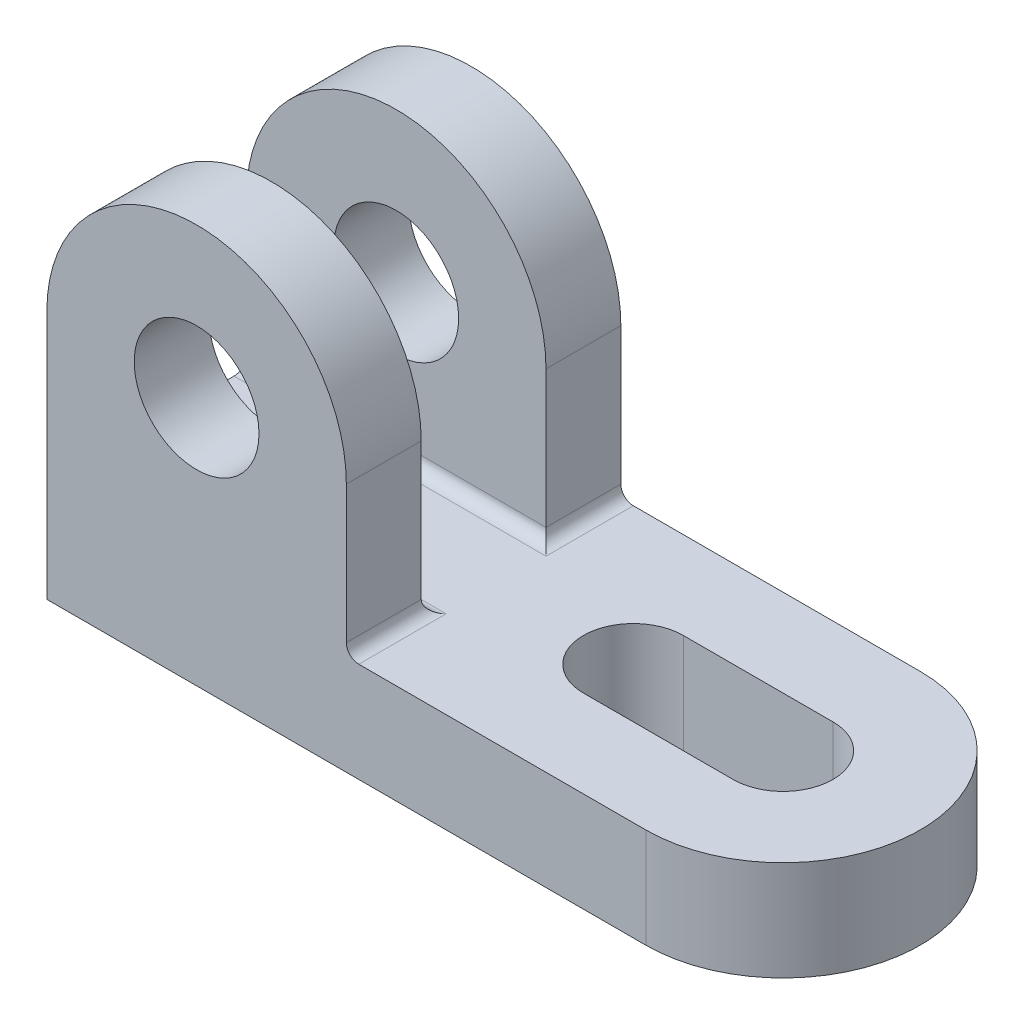
ISO-10303-21;
HEADER;
FILE_DESCRIPTION(('STEP AP214'),'2;1');
FILE_NAME('part.step','',(''),(''),'','','');
FILE_SCHEMA(('AUTOMOTIVE_DESIGN { 1 0 10303 214 1 1 1 1 }'));
ENDSEC;
DATA;
#1=APPLICATION_CONTEXT('core data for automotive mechanical design processes');
#2=APPLICATION_PROTOCOL_DEFINITION('international standard','automotive_design',2000,#1);
#3=PRODUCT_CONTEXT('',#1,'mechanical');
#4=PRODUCT('Part','Part','',(#3));
#5=PRODUCT_RELATED_PRODUCT_CATEGORY('part','',(#4));
#6=PRODUCT_DEFINITION_FORMATION('','',#4);
#7=PRODUCT_DEFINITION_CONTEXT('part definition',#1,'design');
#8=PRODUCT_DEFINITION('design','',#6,#7);
#9=PRODUCT_DEFINITION_SHAPE('','',#8);
#10=(LENGTH_UNIT() NAMED_UNIT(*) SI_UNIT(.MILLI.,.METRE.));
#11=(NAMED_UNIT(*) PLANE_ANGLE_UNIT() SI_UNIT($,.RADIAN.));
#12=(NAMED_UNIT(*) SI_UNIT($,.STERADIAN.) SOLID_ANGLE_UNIT());
#13=UNCERTAINTY_MEASURE_WITH_UNIT(LENGTH_MEASURE(1.E-05),#10,'distance_accuracy_value','');
#14=(GEOMETRIC_REPRESENTATION_CONTEXT(3) GLOBAL_UNCERTAINTY_ASSIGNED_CONTEXT((#13)) GLOBAL_UNIT_ASSIGNED_CONTEXT((#10,
#11,#12)) REPRESENTATION_CONTEXT('',''));
#15=CARTESIAN_POINT('',(0.,0.,0.));
#16=DIRECTION('',(0.,0.,1.));
#17=DIRECTION('',(1.,0.,0.));
#18=AXIS2_PLACEMENT_3D('',#15,#16,#17);
#19=CARTESIAN_POINT('',(-43.7981651376147,40.64,-94.9067889908257));
#20=DIRECTION('',(0.,0.,1.));
#21=DIRECTION('',(1.,0.,0.));
#22=AXIS2_PLACEMENT_3D('',#19,#20,#21);
#23=PLANE('',#22);
#24=CARTESIAN_POINT('',(17.1618348623853,101.6,-94.9067889908257));
#25=DIRECTION('',(0.,0.,1.));
#26=DIRECTION('',(1.,0.,0.));
#27=AXIS2_PLACEMENT_3D('',#24,#25,#26);
#28=CIRCLE('',#27,25.4);
#29=CARTESIAN_POINT('',(42.5618348623853,101.6,-94.9067889908257));
#30=VERTEX_POINT('',#29);
#31=EDGE_CURVE('E247',#30,#30,#28,.T.);
#32=ORIENTED_EDGE('',*,*,#31,.T.);
#33=EDGE_LOOP('',(#32));
#34=FACE_BOUND('',#33,.T.);
#35=DIRECTION('',(0.,-1.,0.));
#36=VECTOR('',#35,1.);
#37=CARTESIAN_POINT('',(-43.7981651376147,40.64,-94.9067889908257));
#38=LINE('',#37,#36);
#39=CARTESIAN_POINT('',(-43.7981651376147,101.6,-94.9067889908257));
#40=VERTEX_POINT('',#39);
#41=CARTESIAN_POINT('',(-43.7981651376147,0.,-94.9067889908257));
#42=VERTEX_POINT('',#41);
#43=EDGE_CURVE('E197',#40,#42,#38,.T.);
#44=ORIENTED_EDGE('',*,*,#43,.F.);
#45=CARTESIAN_POINT('',(17.1618348623853,101.6,-94.9067889908257));
#46=DIRECTION('',(0.,0.,1.));
#47=DIRECTION('',(1.,0.,0.));
#48=AXIS2_PLACEMENT_3D('',#45,#46,#47);
#49=CIRCLE('',#48,60.96);
#50=CARTESIAN_POINT('',(78.1218348623853,101.6,-94.9067889908257));
#51=VERTEX_POINT('',#50);
#52=EDGE_CURVE('E185',#40,#51,#49,.F.);
#53=ORIENTED_EDGE('',*,*,#52,.T.);
#54=DIRECTION('',(0.,-1.,0.));
#55=VECTOR('',#54,1.);
#56=CARTESIAN_POINT('',(78.1218348623853,162.56,-94.9067889908257));
#57=LINE('',#56,#55);
#58=CARTESIAN_POINT('',(78.1218348623853,45.72,-94.9067889908257));
#59=VERTEX_POINT('',#58);
#60=EDGE_CURVE('E257',#51,#59,#57,.T.);
#61=ORIENTED_EDGE('',*,*,#60,.T.);
#62=CARTESIAN_POINT('',(83.2018348623854,45.72,-94.9067889908257));
#63=DIRECTION('',(0.,0.,1.));
#64=DIRECTION('',(1.,0.,0.));
#65=AXIS2_PLACEMENT_3D('',#62,#63,#64);
#66=CIRCLE('',#65,5.08);
#67=CARTESIAN_POINT('',(83.2018348623854,40.64,-94.9067889908257));
#68=VERTEX_POINT('',#67);
#69=EDGE_CURVE('E12',#59,#68,#66,.T.);
#70=ORIENTED_EDGE('',*,*,#69,.T.);
#71=DIRECTION('',(-1.,0.,0.));
#72=VECTOR('',#71,1.);
#73=CARTESIAN_POINT('',(-43.7981651376147,40.64,-94.9067889908257));
#74=LINE('',#73,#72);
#75=CARTESIAN_POINT('',(200.041834862385,40.64,-94.9067889908257));
#76=VERTEX_POINT('',#75);
#77=EDGE_CURVE('E210',#76,#68,#74,.T.);
#78=ORIENTED_EDGE('',*,*,#77,.F.);
#79=DIRECTION('',(0.,-1.,0.));
#80=VECTOR('',#79,1.);
#81=CARTESIAN_POINT('',(200.041834862385,40.64,-94.9067889908257));
#82=LINE('',#81,#80);
#83=CARTESIAN_POINT('',(200.041834862385,0.,-94.9067889908257));
#84=VERTEX_POINT('',#83);
#85=EDGE_CURVE('E206',#76,#84,#82,.T.);
#86=ORIENTED_EDGE('',*,*,#85,.T.);
#87=DIRECTION('',(-1.,0.,0.));
#88=VECTOR('',#87,1.);
#89=CARTESIAN_POINT('',(-43.7981651376147,0.,-94.9067889908257));
#90=LINE('',#89,#88);
#91=EDGE_CURVE('E204',#84,#42,#90,.T.);
#92=ORIENTED_EDGE('',*,*,#91,.T.);
#93=EDGE_LOOP('',(#44,#53,#61,#70,#78,#86,#92));
#94=FACE_BOUND('',#93,.T.);
#95=ADVANCED_FACE('F56',(#34,#94),#23,.F.);
#96=CARTESIAN_POINT('',(0.,162.56,-64.4267889908257));
#97=DIRECTION('',(0.,0.,1.));
#98=DIRECTION('',(1.,0.,0.));
#99=AXIS2_PLACEMENT_3D('',#96,#97,#98);
#100=PLANE('',#99);
#101=CARTESIAN_POINT('',(17.1618348623853,101.6,-64.4267889908257));
#102=DIRECTION('',(0.,0.,1.));
#103=DIRECTION('',(1.,0.,0.));
#104=AXIS2_PLACEMENT_3D('',#101,#102,#103);
#105=CIRCLE('',#104,25.4);
#106=CARTESIAN_POINT('',(42.5618348623853,101.6,-64.4267889908257));
#107=VERTEX_POINT('',#106);
#108=EDGE_CURVE('E336',#107,#107,#105,.T.);
#109=ORIENTED_EDGE('',*,*,#108,.F.);
#110=EDGE_LOOP('',(#109));
#111=FACE_BOUND('',#110,.T.);
#112=DIRECTION('',(0.,-1.,0.));
#113=VECTOR('',#112,1.);
#114=CARTESIAN_POINT('',(-43.7981651376147,162.56,-64.4267889908257));
#115=LINE('',#114,#113);
#116=CARTESIAN_POINT('',(-43.7981651376147,101.6,-64.4267889908257));
#117=VERTEX_POINT('',#116);
#118=CARTESIAN_POINT('',(-43.7981651376147,45.72,-64.4267889908257));
#119=VERTEX_POINT('',#118);
#120=EDGE_CURVE('E200',#117,#119,#115,.T.);
#121=ORIENTED_EDGE('',*,*,#120,.T.);
#122=DIRECTION('',(-1.,0.,0.));
#123=VECTOR('',#122,1.);
#124=CARTESIAN_POINT('',(0.,45.72,-64.4267889908257));
#125=LINE('',#124,#123);
#126=CARTESIAN_POINT('',(78.1218348623853,45.72,-64.4267889908257));
#127=VERTEX_POINT('',#126);
#128=EDGE_CURVE('E82',#119,#127,#125,.F.);
#129=ORIENTED_EDGE('',*,*,#128,.T.);
#130=DIRECTION('',(0.,-1.,0.));
#131=VECTOR('',#130,1.);
#132=CARTESIAN_POINT('',(78.1218348623853,162.56,-64.4267889908257));
#133=LINE('',#132,#131);
#134=CARTESIAN_POINT('',(78.1218348623853,101.6,-64.4267889908257));
#135=VERTEX_POINT('',#134);
#136=EDGE_CURVE('E286',#135,#127,#133,.T.);
#137=ORIENTED_EDGE('',*,*,#136,.F.);
#138=CARTESIAN_POINT('',(17.1618348623853,101.6,-64.4267889908257));
#139=DIRECTION('',(0.,0.,1.));
#140=DIRECTION('',(1.,0.,0.));
#141=AXIS2_PLACEMENT_3D('',#138,#139,#140);
#142=CIRCLE('',#141,60.96);
#143=EDGE_CURVE('E322',#117,#135,#142,.F.);
#144=ORIENTED_EDGE('',*,*,#143,.F.);
#145=EDGE_LOOP('',(#121,#129,#137,#144));
#146=FACE_BOUND('',#145,.T.);
#147=ADVANCED_FACE('F364',(#111,#146),#100,.T.);
#148=CARTESIAN_POINT('',(0.,162.56,-13.6267889908257));
#149=DIRECTION('',(0.,0.,1.));
#150=DIRECTION('',(1.,0.,0.));
#151=AXIS2_PLACEMENT_3D('',#148,#149,#150);
#152=PLANE('',#151);
#153=CARTESIAN_POINT('',(17.1618348623853,101.6,-13.6267889908257));
#154=DIRECTION('',(0.,0.,1.));
#155=DIRECTION('',(1.,0.,0.));
#156=AXIS2_PLACEMENT_3D('',#153,#154,#155);
#157=CIRCLE('',#156,25.4);
#158=CARTESIAN_POINT('',(42.5618348623853,101.6,-13.6267889908257));
#159=VERTEX_POINT('',#158);
#160=EDGE_CURVE('E345',#159,#159,#157,.T.);
#161=ORIENTED_EDGE('',*,*,#160,.T.);
#162=EDGE_LOOP('',(#161));
#163=FACE_BOUND('',#162,.T.);
#164=DIRECTION('',(0.,-1.,0.));
#165=VECTOR('',#164,1.);
#166=CARTESIAN_POINT('',(78.1218348623853,162.56,-13.6267889908257));
#167=LINE('',#166,#165);
#168=CARTESIAN_POINT('',(78.1218348623853,101.6,-13.6267889908257));
#169=VERTEX_POINT('',#168);
#170=CARTESIAN_POINT('',(78.1218348623853,45.72,-13.6267889908257));
#171=VERTEX_POINT('',#170);
#172=EDGE_CURVE('E283',#169,#171,#167,.T.);
#173=ORIENTED_EDGE('',*,*,#172,.T.);
#174=DIRECTION('',(-1.,0.,0.));
#175=VECTOR('',#174,1.);
#176=CARTESIAN_POINT('',(-43.7981651376147,45.72,-13.6267889908257));
#177=LINE('',#176,#175);
#178=CARTESIAN_POINT('',(-43.7981651376147,45.72,-13.6267889908257));
#179=VERTEX_POINT('',#178);
#180=EDGE_CURVE('E231',#171,#179,#177,.T.);
#181=ORIENTED_EDGE('',*,*,#180,.T.);
#182=DIRECTION('',(0.,-1.,0.));
#183=VECTOR('',#182,1.);
#184=CARTESIAN_POINT('',(-43.7981651376147,162.56,-13.6267889908257));
#185=LINE('',#184,#183);
#186=CARTESIAN_POINT('',(-43.7981651376147,101.6,-13.6267889908257));
#187=VERTEX_POINT('',#186);
#188=EDGE_CURVE('E297',#187,#179,#185,.T.);
#189=ORIENTED_EDGE('',*,*,#188,.F.);
#190=CARTESIAN_POINT('',(17.1618348623853,101.6,-13.6267889908257));
#191=DIRECTION('',(0.,0.,1.));
#192=DIRECTION('',(1.,0.,0.));
#193=AXIS2_PLACEMENT_3D('',#190,#191,#192);
#194=CIRCLE('',#193,60.96);
#195=EDGE_CURVE('E331',#187,#169,#194,.F.);
#196=ORIENTED_EDGE('',*,*,#195,.T.);
#197=EDGE_LOOP('',(#173,#181,#189,#196));
#198=FACE_BOUND('',#197,.T.);
#199=ADVANCED_FACE('F367',(#163,#198),#152,.F.);
#200=CARTESIAN_POINT('',(-43.7981651376147,40.64,-94.9067889908257));
#201=DIRECTION('',(1.,0.,0.));
#202=DIRECTION('',(0.,0.,-1.));
#203=AXIS2_PLACEMENT_3D('',#200,#201,#202);
#204=PLANE('',#203);
#205=DIRECTION('',(0.,0.,1.));
#206=VECTOR('',#205,1.);
#207=CARTESIAN_POINT('',(-43.7981651376147,101.6,-94.9067889908257));
#208=LINE('',#207,#206);
#209=EDGE_CURVE('E183',#40,#117,#208,.T.);
#210=ORIENTED_EDGE('',*,*,#209,.F.);
#211=ORIENTED_EDGE('',*,*,#43,.T.);
#212=DIRECTION('',(0.,0.,1.));
#213=VECTOR('',#212,1.);
#214=CARTESIAN_POINT('',(-43.7981651376147,0.,-94.9067889908257));
#215=LINE('',#214,#213);
#216=CARTESIAN_POINT('',(-43.7981651376147,0.,16.8532110091743));
#217=VERTEX_POINT('',#216);
#218=EDGE_CURVE('E279',#42,#217,#215,.T.);
#219=ORIENTED_EDGE('',*,*,#218,.T.);
#220=DIRECTION('',(0.,-1.,0.));
#221=VECTOR('',#220,1.);
#222=CARTESIAN_POINT('',(-43.7981651376147,40.64,16.8532110091743));
#223=LINE('',#222,#221);
#224=CARTESIAN_POINT('',(-43.7981651376147,101.6,16.8532110091743));
#225=VERTEX_POINT('',#224);
#226=EDGE_CURVE('E218',#225,#217,#223,.T.);
#227=ORIENTED_EDGE('',*,*,#226,.F.);
#228=EDGE_CURVE('E199',#187,#225,#208,.T.);
#229=ORIENTED_EDGE('',*,*,#228,.F.);
#230=ORIENTED_EDGE('',*,*,#188,.T.);
#231=CARTESIAN_POINT('',(-43.7981651376147,45.72,-18.7067889908257));
#232=DIRECTION('',(1.,0.,0.));
#233=DIRECTION('',(0.,0.,-1.));
#234=AXIS2_PLACEMENT_3D('',#231,#232,#233);
#235=CIRCLE('',#234,5.08);
#236=CARTESIAN_POINT('',(-43.7981651376147,40.64,-18.7067889908257));
#237=VERTEX_POINT('',#236);
#238=EDGE_CURVE('E239',#179,#237,#235,.T.);
#239=ORIENTED_EDGE('',*,*,#238,.T.);
#240=DIRECTION('',(0.,0.,1.));
#241=VECTOR('',#240,1.);
#242=CARTESIAN_POINT('',(-43.7981651376147,40.64,-94.9067889908257));
#243=LINE('',#242,#241);
#244=CARTESIAN_POINT('',(-43.7981651376147,40.64,-59.3467889908257));
#245=VERTEX_POINT('',#244);
#246=EDGE_CURVE('E276',#245,#237,#243,.T.);
#247=ORIENTED_EDGE('',*,*,#246,.F.);
#248=CARTESIAN_POINT('',(-43.7981651376147,45.72,-59.3467889908257));
#249=DIRECTION('',(1.,0.,0.));
#250=DIRECTION('',(0.,0.,-1.));
#251=AXIS2_PLACEMENT_3D('',#248,#249,#250);
#252=CIRCLE('',#251,5.08);
#253=EDGE_CURVE('E66',#245,#119,#252,.T.);
#254=ORIENTED_EDGE('',*,*,#253,.T.);
#255=ORIENTED_EDGE('',*,*,#120,.F.);
#256=EDGE_LOOP('',(#210,#211,#219,#227,#229,#230,#239,#247,#254,#255));
#257=FACE_BOUND('',#256,.T.);
#258=ADVANCED_FACE('F194',(#257),#204,.F.);
#259=CARTESIAN_POINT('',(78.1218348623853,162.56,0.));
#260=DIRECTION('',(1.,0.,0.));
#261=DIRECTION('',(0.,0.,-1.));
#262=AXIS2_PLACEMENT_3D('',#259,#260,#261);
#263=PLANE('',#262);
#264=DIRECTION('',(0.,-1.,0.));
#265=VECTOR('',#264,1.);
#266=CARTESIAN_POINT('',(78.1218348623853,162.56,16.8532110091743));
#267=LINE('',#266,#265);
#268=CARTESIAN_POINT('',(78.1218348623853,101.6,16.8532110091743));
#269=VERTEX_POINT('',#268);
#270=CARTESIAN_POINT('',(78.1218348623853,45.72,16.8532110091743));
#271=VERTEX_POINT('',#270);
#272=EDGE_CURVE('E289',#269,#271,#267,.T.);
#273=ORIENTED_EDGE('',*,*,#272,.T.);
#274=DIRECTION('',(0.,0.,1.));
#275=VECTOR('',#274,1.);
#276=CARTESIAN_POINT('',(78.1218348623853,45.72,0.));
#277=LINE('',#276,#275);
#278=EDGE_CURVE('E233',#271,#171,#277,.F.);
#279=ORIENTED_EDGE('',*,*,#278,.T.);
#280=ORIENTED_EDGE('',*,*,#172,.F.);
#281=DIRECTION('',(0.,0.,1.));
#282=VECTOR('',#281,1.);
#283=CARTESIAN_POINT('',(78.1218348623853,101.6,-94.9067889908257));
#284=LINE('',#283,#282);
#285=EDGE_CURVE('E193',#169,#269,#284,.T.);
#286=ORIENTED_EDGE('',*,*,#285,.T.);
#287=EDGE_LOOP('',(#273,#279,#280,#286));
#288=FACE_BOUND('',#287,.T.);
#289=ADVANCED_FACE('F384',(#288),#263,.T.);
#290=CARTESIAN_POINT('',(200.041834862385,40.64,-39.0267889908257));
#291=DIRECTION('',(0.,-1.,0.));
#292=DIRECTION('',(0.,0.,-1.));
#293=AXIS2_PLACEMENT_3D('',#290,#291,#292);
#294=PLANE('',#293);
#295=DIRECTION('',(-1.,0.,0.));
#296=VECTOR('',#295,1.);
#297=CARTESIAN_POINT('',(78.1218348623853,40.64,-18.7067889908257));
#298=LINE('',#297,#296);
#299=CARTESIAN_POINT('',(83.2018348623853,40.64,-18.7067889908257));
#300=VERTEX_POINT('',#299);
#301=EDGE_CURVE('E227',#237,#300,#298,.F.);
#302=ORIENTED_EDGE('',*,*,#301,.T.);
#303=DIRECTION('',(0.,0.,1.));
#304=VECTOR('',#303,1.);
#305=CARTESIAN_POINT('',(83.2018348623853,40.64,-39.0267889908257));
#306=LINE('',#305,#304);
#307=CARTESIAN_POINT('',(83.2018348623853,40.64,16.8532110091743));
#308=VERTEX_POINT('',#307);
#309=EDGE_CURVE('E230',#300,#308,#306,.T.);
#310=ORIENTED_EDGE('',*,*,#309,.T.);
#311=DIRECTION('',(1.,0.,0.));
#312=VECTOR('',#311,1.);
#313=CARTESIAN_POINT('',(-43.7981651376147,40.64,16.8532110091743));
#314=LINE('',#313,#312);
#315=CARTESIAN_POINT('',(200.041834862385,40.64,16.8532110091743));
#316=VERTEX_POINT('',#315);
#317=EDGE_CURVE('E270',#308,#316,#314,.T.);
#318=ORIENTED_EDGE('',*,*,#317,.T.);
#319=CARTESIAN_POINT('',(200.041834862385,40.64,-39.0267889908257));
#320=DIRECTION('',(0.,1.,0.));
#321=DIRECTION('',(0.,0.,-1.));
#322=AXIS2_PLACEMENT_3D('',#319,#320,#321);
#323=CIRCLE('',#322,55.88);
#324=EDGE_CURVE('E215',#316,#76,#323,.T.);
#325=ORIENTED_EDGE('',*,*,#324,.T.);
#326=ORIENTED_EDGE('',*,*,#77,.T.);
#327=DIRECTION('',(0.,0.,-1.));
#328=VECTOR('',#327,1.);
#329=CARTESIAN_POINT('',(83.2018348623853,40.64,-64.4267889908257));
#330=LINE('',#329,#328);
#331=CARTESIAN_POINT('',(83.2018348623853,40.64,-59.3467889908257));
#332=VERTEX_POINT('',#331);
#333=EDGE_CURVE('E222',#68,#332,#330,.F.);
#334=ORIENTED_EDGE('',*,*,#333,.T.);
#335=DIRECTION('',(-1.,0.,0.));
#336=VECTOR('',#335,1.);
#337=CARTESIAN_POINT('',(200.041834862385,40.64,-59.3467889908256));
#338=LINE('',#337,#336);
#339=EDGE_CURVE('E224',#332,#245,#338,.T.);
#340=ORIENTED_EDGE('',*,*,#339,.T.);
#341=ORIENTED_EDGE('',*,*,#246,.T.);
#342=EDGE_LOOP('',(#302,#310,#318,#325,#326,#334,#340,#341));
#343=FACE_BOUND('',#342,.T.);
#344=CARTESIAN_POINT('',(200.041834862385,40.64,-39.0267889908257));
#345=DIRECTION('',(0.,-1.,0.));
#346=DIRECTION('',(0.,0.,-1.));
#347=AXIS2_PLACEMENT_3D('',#344,#345,#346);
#348=CIRCLE('',#347,20.32);
#349=CARTESIAN_POINT('',(200.041834862385,40.64,-59.3467889908257));
#350=VERTEX_POINT('',#349);
#351=CARTESIAN_POINT('',(200.041834862385,40.64,-18.7067889908257));
#352=VERTEX_POINT('',#351);
#353=EDGE_CURVE('E321',#350,#352,#348,.T.);
#354=ORIENTED_EDGE('',*,*,#353,.T.);
#355=DIRECTION('',(-1.,0.,0.));
#356=VECTOR('',#355,1.);
#357=CARTESIAN_POINT('',(200.041834862385,40.64,-18.7067889908257));
#358=LINE('',#357,#356);
#359=CARTESIAN_POINT('',(139.081834862385,40.64,-18.7067889908257));
#360=VERTEX_POINT('',#359);
#361=EDGE_CURVE('E318',#352,#360,#358,.T.);
#362=ORIENTED_EDGE('',*,*,#361,.T.);
#363=CARTESIAN_POINT('',(139.081834862385,40.64,-39.0267889908257));
#364=DIRECTION('',(0.,1.,0.));
#365=DIRECTION('',(0.,0.,1.));
#366=AXIS2_PLACEMENT_3D('',#363,#364,#365);
#367=CIRCLE('',#366,20.32);
#368=CARTESIAN_POINT('',(139.081834862385,40.64,-59.3467889908257));
#369=VERTEX_POINT('',#368);
#370=EDGE_CURVE('E312',#369,#360,#367,.T.);
#371=ORIENTED_EDGE('',*,*,#370,.F.);
#372=DIRECTION('',(-1.,0.,0.));
#373=VECTOR('',#372,1.);
#374=CARTESIAN_POINT('',(200.041834862385,40.64,-59.3467889908257));
#375=LINE('',#374,#373);
#376=EDGE_CURVE('E313',#350,#369,#375,.T.);
#377=ORIENTED_EDGE('',*,*,#376,.F.);
#378=EDGE_LOOP('',(#354,#362,#371,#377));
#379=FACE_BOUND('',#378,.T.);
#380=ADVANCED_FACE('F265',(#343,#379),#294,.F.);
#381=CARTESIAN_POINT('',(200.041834862385,0.,-39.0267889908257));
#382=DIRECTION('',(0.,-1.,0.));
#383=DIRECTION('',(0.,0.,-1.));
#384=AXIS2_PLACEMENT_3D('',#381,#382,#383);
#385=PLANE('',#384);
#386=ORIENTED_EDGE('',*,*,#218,.F.);
#387=ORIENTED_EDGE('',*,*,#91,.F.);
#388=CARTESIAN_POINT('',(200.041834862385,0.,-39.0267889908257));
#389=DIRECTION('',(0.,1.,0.));
#390=DIRECTION('',(0.,0.,-1.));
#391=AXIS2_PLACEMENT_3D('',#388,#389,#390);
#392=CIRCLE('',#391,55.88);
#393=CARTESIAN_POINT('',(200.041834862385,0.,16.8532110091743));
#394=VERTEX_POINT('',#393);
#395=EDGE_CURVE('E272',#394,#84,#392,.T.);
#396=ORIENTED_EDGE('',*,*,#395,.F.);
#397=DIRECTION('',(1.,0.,0.));
#398=VECTOR('',#397,1.);
#399=CARTESIAN_POINT('',(-43.7981651376147,0.,16.8532110091743));
#400=LINE('',#399,#398);
#401=EDGE_CURVE('E284',#217,#394,#400,.T.);
#402=ORIENTED_EDGE('',*,*,#401,.F.);
#403=EDGE_LOOP('',(#386,#387,#396,#402));
#404=FACE_BOUND('',#403,.T.);
#405=DIRECTION('',(-1.,0.,0.));
#406=VECTOR('',#405,1.);
#407=CARTESIAN_POINT('',(200.041834862385,0.,-18.7067889908257));
#408=LINE('',#407,#406);
#409=CARTESIAN_POINT('',(200.041834862385,0.,-18.7067889908257));
#410=VERTEX_POINT('',#409);
#411=CARTESIAN_POINT('',(139.081834862385,0.,-18.7067889908257));
#412=VERTEX_POINT('',#411);
#413=EDGE_CURVE('E329',#410,#412,#408,.T.);
#414=ORIENTED_EDGE('',*,*,#413,.F.);
#415=CARTESIAN_POINT('',(200.041834862385,0.,-39.0267889908257));
#416=DIRECTION('',(0.,-1.,0.));
#417=DIRECTION('',(0.,0.,-1.));
#418=AXIS2_PLACEMENT_3D('',#415,#416,#417);
#419=CIRCLE('',#418,20.32);
#420=CARTESIAN_POINT('',(200.041834862385,0.,-59.3467889908257));
#421=VERTEX_POINT('',#420);
#422=EDGE_CURVE('E314',#421,#410,#419,.T.);
#423=ORIENTED_EDGE('',*,*,#422,.F.);
#424=DIRECTION('',(-1.,0.,0.));
#425=VECTOR('',#424,1.);
#426=CARTESIAN_POINT('',(200.041834862385,0.,-59.3467889908257));
#427=LINE('',#426,#425);
#428=CARTESIAN_POINT('',(139.081834862385,0.,-59.3467889908257));
#429=VERTEX_POINT('',#428);
#430=EDGE_CURVE('E309',#421,#429,#427,.T.);
#431=ORIENTED_EDGE('',*,*,#430,.T.);
#432=CARTESIAN_POINT('',(139.081834862385,0.,-39.0267889908257));
#433=DIRECTION('',(0.,1.,0.));
#434=DIRECTION('',(0.,0.,1.));
#435=AXIS2_PLACEMENT_3D('',#432,#433,#434);
#436=CIRCLE('',#435,20.32);
#437=EDGE_CURVE('E330',#429,#412,#436,.T.);
#438=ORIENTED_EDGE('',*,*,#437,.T.);
#439=EDGE_LOOP('',(#414,#423,#431,#438));
#440=FACE_BOUND('',#439,.T.);
#441=ADVANCED_FACE('F274',(#404,#440),#385,.T.);
#442=CARTESIAN_POINT('',(-43.7981651376147,40.64,16.8532110091743));
#443=DIRECTION('',(0.,0.,-1.));
#444=DIRECTION('',(-1.,0.,0.));
#445=AXIS2_PLACEMENT_3D('',#442,#443,#444);
#446=PLANE('',#445);
#447=CARTESIAN_POINT('',(17.1618348623853,101.6,16.8532110091743));
#448=DIRECTION('',(0.,0.,1.));
#449=DIRECTION('',(1.,0.,0.));
#450=AXIS2_PLACEMENT_3D('',#447,#448,#449);
#451=CIRCLE('',#450,25.4);
#452=CARTESIAN_POINT('',(42.5618348623853,101.6,16.8532110091743));
#453=VERTEX_POINT('',#452);
#454=EDGE_CURVE('E245',#453,#453,#451,.T.);
#455=ORIENTED_EDGE('',*,*,#454,.F.);
#456=EDGE_LOOP('',(#455));
#457=FACE_BOUND('',#456,.T.);
#458=CARTESIAN_POINT('',(17.1618348623853,101.6,16.8532110091743));
#459=DIRECTION('',(0.,0.,1.));
#460=DIRECTION('',(1.,0.,0.));
#461=AXIS2_PLACEMENT_3D('',#458,#459,#460);
#462=CIRCLE('',#461,60.96);
#463=EDGE_CURVE('E195',#225,#269,#462,.F.);
#464=ORIENTED_EDGE('',*,*,#463,.F.);
#465=ORIENTED_EDGE('',*,*,#226,.T.);
#466=ORIENTED_EDGE('',*,*,#401,.T.);
#467=DIRECTION('',(0.,-1.,0.));
#468=VECTOR('',#467,1.);
#469=CARTESIAN_POINT('',(200.041834862385,40.64,16.8532110091743));
#470=LINE('',#469,#468);
#471=EDGE_CURVE('E207',#316,#394,#470,.T.);
#472=ORIENTED_EDGE('',*,*,#471,.F.);
#473=ORIENTED_EDGE('',*,*,#317,.F.);
#474=CARTESIAN_POINT('',(83.2018348623853,45.72,16.8532110091743));
#475=DIRECTION('',(0.,0.,-1.));
#476=DIRECTION('',(-1.,0.,0.));
#477=AXIS2_PLACEMENT_3D('',#474,#475,#476);
#478=CIRCLE('',#477,5.08);
#479=EDGE_CURVE('E240',#308,#271,#478,.T.);
#480=ORIENTED_EDGE('',*,*,#479,.T.);
#481=ORIENTED_EDGE('',*,*,#272,.F.);
#482=EDGE_LOOP('',(#464,#465,#466,#472,#473,#480,#481));
#483=FACE_BOUND('',#482,.T.);
#484=ADVANCED_FACE('F377',(#457,#483),#446,.F.);
#485=CARTESIAN_POINT('',(200.041834862385,40.64,-39.0267889908257));
#486=DIRECTION('',(0.,-1.,0.));
#487=DIRECTION('',(0.,0.,-1.));
#488=AXIS2_PLACEMENT_3D('',#485,#486,#487);
#489=CYLINDRICAL_SURFACE('',#488,55.88);
#490=ORIENTED_EDGE('',*,*,#395,.T.);
#491=ORIENTED_EDGE('',*,*,#85,.F.);
#492=ORIENTED_EDGE('',*,*,#324,.F.);
#493=ORIENTED_EDGE('',*,*,#471,.T.);
#494=EDGE_LOOP('',(#490,#491,#492,#493));
#495=FACE_BOUND('',#494,.T.);
#496=ADVANCED_FACE('F271',(#495),#489,.T.);
#497=CARTESIAN_POINT('',(78.1218348623853,162.56,0.));
#498=DIRECTION('',(-1.,0.,0.));
#499=DIRECTION('',(0.,0.,1.));
#500=AXIS2_PLACEMENT_3D('',#497,#498,#499);
#501=PLANE('',#500);
#502=ORIENTED_EDGE('',*,*,#136,.T.);
#503=DIRECTION('',(0.,0.,-1.));
#504=VECTOR('',#503,1.);
#505=CARTESIAN_POINT('',(78.1218348623854,45.72,-94.9067889908257));
#506=LINE('',#505,#504);
#507=EDGE_CURVE('E77',#127,#59,#506,.T.);
#508=ORIENTED_EDGE('',*,*,#507,.T.);
#509=ORIENTED_EDGE('',*,*,#60,.F.);
#510=EDGE_CURVE('E190',#51,#135,#284,.T.);
#511=ORIENTED_EDGE('',*,*,#510,.T.);
#512=EDGE_LOOP('',(#502,#508,#509,#511));
#513=FACE_BOUND('',#512,.T.);
#514=ADVANCED_FACE('F378',(#513),#501,.F.);
#515=CARTESIAN_POINT('',(200.041834862385,0.,-39.0267889908257));
#516=DIRECTION('',(0.,1.,0.));
#517=DIRECTION('',(0.,0.,1.));
#518=AXIS2_PLACEMENT_3D('',#515,#516,#517);
#519=CYLINDRICAL_SURFACE('',#518,20.32);
#520=ORIENTED_EDGE('',*,*,#353,.F.);
#521=DIRECTION('',(0.,1.,0.));
#522=VECTOR('',#521,1.);
#523=CARTESIAN_POINT('',(200.041834862385,0.,-59.3467889908257));
#524=LINE('',#523,#522);
#525=EDGE_CURVE('E307',#421,#350,#524,.T.);
#526=ORIENTED_EDGE('',*,*,#525,.F.);
#527=ORIENTED_EDGE('',*,*,#422,.T.);
#528=DIRECTION('',(0.,1.,0.));
#529=VECTOR('',#528,1.);
#530=CARTESIAN_POINT('',(200.041834862385,0.,-18.7067889908257));
#531=LINE('',#530,#529);
#532=EDGE_CURVE('E291',#410,#352,#531,.T.);
#533=ORIENTED_EDGE('',*,*,#532,.T.);
#534=EDGE_LOOP('',(#520,#526,#527,#533));
#535=FACE_BOUND('',#534,.T.);
#536=ADVANCED_FACE('F406',(#535),#519,.F.);
#537=CARTESIAN_POINT('',(200.041834862385,0.,-18.7067889908257));
#538=DIRECTION('',(0.,0.,-1.));
#539=DIRECTION('',(-1.,0.,0.));
#540=AXIS2_PLACEMENT_3D('',#537,#538,#539);
#541=PLANE('',#540);
#542=ORIENTED_EDGE('',*,*,#361,.F.);
#543=ORIENTED_EDGE('',*,*,#532,.F.);
#544=ORIENTED_EDGE('',*,*,#413,.T.);
#545=DIRECTION('',(0.,1.,0.));
#546=VECTOR('',#545,1.);
#547=CARTESIAN_POINT('',(139.081834862385,0.,-18.7067889908257));
#548=LINE('',#547,#546);
#549=EDGE_CURVE('E301',#412,#360,#548,.T.);
#550=ORIENTED_EDGE('',*,*,#549,.T.);
#551=EDGE_LOOP('',(#542,#543,#544,#550));
#552=FACE_BOUND('',#551,.T.);
#553=ADVANCED_FACE('F515',(#552),#541,.T.);
#554=CARTESIAN_POINT('',(139.081834862385,0.,-39.0267889908257));
#555=DIRECTION('',(0.,1.,0.));
#556=DIRECTION('',(0.,0.,1.));
#557=AXIS2_PLACEMENT_3D('',#554,#555,#556);
#558=CYLINDRICAL_SURFACE('',#557,20.32);
#559=ORIENTED_EDGE('',*,*,#370,.T.);
#560=ORIENTED_EDGE('',*,*,#549,.F.);
#561=ORIENTED_EDGE('',*,*,#437,.F.);
#562=DIRECTION('',(0.,1.,0.));
#563=VECTOR('',#562,1.);
#564=CARTESIAN_POINT('',(139.081834862385,0.,-59.3467889908257));
#565=LINE('',#564,#563);
#566=EDGE_CURVE('E304',#429,#369,#565,.T.);
#567=ORIENTED_EDGE('',*,*,#566,.T.);
#568=EDGE_LOOP('',(#559,#560,#561,#567));
#569=FACE_BOUND('',#568,.T.);
#570=ADVANCED_FACE('F506',(#569),#558,.F.);
#571=CARTESIAN_POINT('',(200.041834862385,0.,-59.3467889908257));
#572=DIRECTION('',(0.,0.,-1.));
#573=DIRECTION('',(-1.,0.,0.));
#574=AXIS2_PLACEMENT_3D('',#571,#572,#573);
#575=PLANE('',#574);
#576=ORIENTED_EDGE('',*,*,#376,.T.);
#577=ORIENTED_EDGE('',*,*,#566,.F.);
#578=ORIENTED_EDGE('',*,*,#430,.F.);
#579=ORIENTED_EDGE('',*,*,#525,.T.);
#580=EDGE_LOOP('',(#576,#577,#578,#579));
#581=FACE_BOUND('',#580,.T.);
#582=ADVANCED_FACE('F472',(#581),#575,.F.);
#583=CARTESIAN_POINT('',(17.1618348623853,101.6,-94.9067889908257));
#584=DIRECTION('',(0.,0.,1.));
#585=DIRECTION('',(1.,0.,0.));
#586=AXIS2_PLACEMENT_3D('',#583,#584,#585);
#587=CYLINDRICAL_SURFACE('',#586,60.96);
#588=ORIENTED_EDGE('',*,*,#195,.F.);
#589=ORIENTED_EDGE('',*,*,#228,.T.);
#590=ORIENTED_EDGE('',*,*,#463,.T.);
#591=ORIENTED_EDGE('',*,*,#285,.F.);
#592=EDGE_LOOP('',(#588,#589,#590,#591));
#593=FACE_BOUND('',#592,.T.);
#594=ADVANCED_FACE('F470',(#593),#587,.T.);
#595=ORIENTED_EDGE('',*,*,#143,.T.);
#596=ORIENTED_EDGE('',*,*,#510,.F.);
#597=ORIENTED_EDGE('',*,*,#52,.F.);
#598=ORIENTED_EDGE('',*,*,#209,.T.);
#599=EDGE_LOOP('',(#595,#596,#597,#598));
#600=FACE_BOUND('',#599,.T.);
#601=ADVANCED_FACE('F184',(#600),#587,.T.);
#602=CARTESIAN_POINT('',(17.1618348623853,101.6,-94.9067889908257));
#603=DIRECTION('',(0.,0.,1.));
#604=DIRECTION('',(1.,0.,0.));
#605=AXIS2_PLACEMENT_3D('',#602,#603,#604);
#606=CYLINDRICAL_SURFACE('',#605,25.4);
#607=ORIENTED_EDGE('',*,*,#454,.T.);
#608=EDGE_LOOP('',(#607));
#609=FACE_BOUND('',#608,.T.);
#610=ORIENTED_EDGE('',*,*,#160,.F.);
#611=EDGE_LOOP('',(#610));
#612=FACE_BOUND('',#611,.T.);
#613=ADVANCED_FACE('F354',(#609,#612),#606,.F.);
#614=ORIENTED_EDGE('',*,*,#108,.T.);
#615=EDGE_LOOP('',(#614));
#616=FACE_BOUND('',#615,.T.);
#617=ORIENTED_EDGE('',*,*,#31,.F.);
#618=EDGE_LOOP('',(#617));
#619=FACE_BOUND('',#618,.T.);
#620=ADVANCED_FACE('F349',(#616,#619),#606,.F.);
#621=CARTESIAN_POINT('',(0.,45.72,-18.7067889908257));
#622=DIRECTION('',(1.,0.,0.));
#623=DIRECTION('',(0.,0.,-1.));
#624=AXIS2_PLACEMENT_3D('',#621,#622,#623);
#625=CYLINDRICAL_SURFACE('',#624,5.08);
#626=ORIENTED_EDGE('',*,*,#238,.F.);
#627=ORIENTED_EDGE('',*,*,#180,.F.);
#628=CARTESIAN_POINT('',(83.2018348623853,45.72,-18.7067889908257));
#629=DIRECTION('',(0.707106781186547,0.,0.707106781186547));
#630=DIRECTION('',(0.707106781186547,0.,-0.707106781186547));
#631=AXIS2_PLACEMENT_3D('',#628,#629,#630);
#632=ELLIPSE('',#631,7.18420489685532,5.08);
#633=EDGE_CURVE('E242',#300,#171,#632,.F.);
#634=ORIENTED_EDGE('',*,*,#633,.F.);
#635=ORIENTED_EDGE('',*,*,#301,.F.);
#636=EDGE_LOOP('',(#626,#627,#634,#635));
#637=FACE_BOUND('',#636,.T.);
#638=ADVANCED_FACE('F352',(#637),#625,.F.);
#639=CARTESIAN_POINT('',(83.2018348623853,45.72,-39.0267889908257));
#640=DIRECTION('',(0.,0.,1.));
#641=DIRECTION('',(1.,0.,0.));
#642=AXIS2_PLACEMENT_3D('',#639,#640,#641);
#643=CYLINDRICAL_SURFACE('',#642,5.08);
#644=ORIENTED_EDGE('',*,*,#633,.T.);
#645=ORIENTED_EDGE('',*,*,#278,.F.);
#646=ORIENTED_EDGE('',*,*,#479,.F.);
#647=ORIENTED_EDGE('',*,*,#309,.F.);
#648=EDGE_LOOP('',(#644,#645,#646,#647));
#649=FACE_BOUND('',#648,.T.);
#650=ADVANCED_FACE('F359',(#649),#643,.F.);
#651=CARTESIAN_POINT('',(83.2018348623853,45.72,0.));
#652=DIRECTION('',(0.,0.,1.));
#653=DIRECTION('',(1.,0.,0.));
#654=AXIS2_PLACEMENT_3D('',#651,#652,#653);
#655=CYLINDRICAL_SURFACE('',#654,5.08);
#656=ORIENTED_EDGE('',*,*,#69,.F.);
#657=ORIENTED_EDGE('',*,*,#507,.F.);
#658=CARTESIAN_POINT('',(83.2018348623853,45.72,-59.3467889908257));
#659=DIRECTION('',(-0.707106781186548,0.,0.707106781186547));
#660=DIRECTION('',(0.707106781186547,0.,0.707106781186548));
#661=AXIS2_PLACEMENT_3D('',#658,#659,#660);
#662=ELLIPSE('',#661,7.18420489685532,5.08);
#663=EDGE_CURVE('E65',#332,#127,#662,.F.);
#664=ORIENTED_EDGE('',*,*,#663,.F.);
#665=ORIENTED_EDGE('',*,*,#333,.F.);
#666=EDGE_LOOP('',(#656,#657,#664,#665));
#667=FACE_BOUND('',#666,.T.);
#668=ADVANCED_FACE('F62',(#667),#655,.F.);
#669=CARTESIAN_POINT('',(200.041834862385,45.72,-59.3467889908256));
#670=DIRECTION('',(-1.,0.,0.));
#671=DIRECTION('',(0.,0.,1.));
#672=AXIS2_PLACEMENT_3D('',#669,#670,#671);
#673=CYLINDRICAL_SURFACE('',#672,5.08);
#674=ORIENTED_EDGE('',*,*,#663,.T.);
#675=ORIENTED_EDGE('',*,*,#128,.F.);
#676=ORIENTED_EDGE('',*,*,#253,.F.);
#677=ORIENTED_EDGE('',*,*,#339,.F.);
#678=EDGE_LOOP('',(#674,#675,#676,#677));
#679=FACE_BOUND('',#678,.T.);
#680=ADVANCED_FACE('F254',(#679),#673,.F.);
#681=CLOSED_SHELL('',(#95,#147,#199,#258,#289,#380,#441,#484,#496,#514,#536,#553,#570,#582,#594,
#601,#613,#620,#638,#650,#668,#680));
#682=MANIFOLD_SOLID_BREP('B2',#681);
#683=ADVANCED_BREP_SHAPE_REPRESENTATION('',(#18,#682),#14);
#684=SHAPE_DEFINITION_REPRESENTATION(#9,#683);
ENDSEC;
END-ISO-10303-21;
